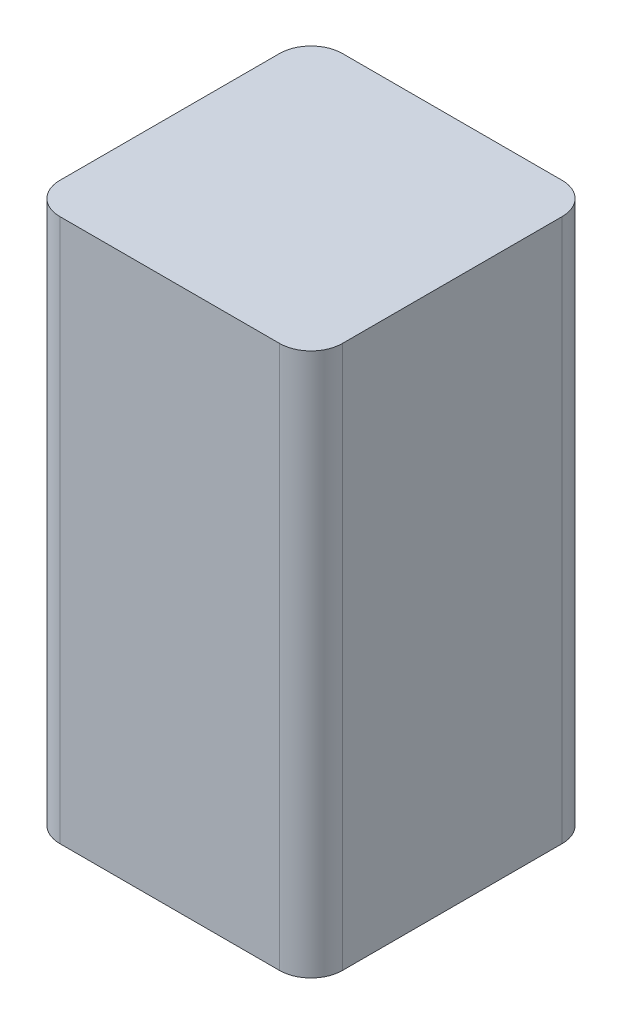
ISO-10303-21;
HEADER;
FILE_DESCRIPTION(('STEP AP214'),'2;1');
FILE_NAME('part.step','',(''),(''),'','','');
FILE_SCHEMA(('AUTOMOTIVE_DESIGN { 1 0 10303 214 1 1 1 1 }'));
ENDSEC;
DATA;
#1=APPLICATION_CONTEXT('core data for automotive mechanical design processes');
#2=APPLICATION_PROTOCOL_DEFINITION('international standard','automotive_design',2000,#1);
#3=PRODUCT_CONTEXT('',#1,'mechanical');
#4=PRODUCT('Part','Part','',(#3));
#5=PRODUCT_RELATED_PRODUCT_CATEGORY('part','',(#4));
#6=PRODUCT_DEFINITION_FORMATION('','',#4);
#7=PRODUCT_DEFINITION_CONTEXT('part definition',#1,'design');
#8=PRODUCT_DEFINITION('design','',#6,#7);
#9=PRODUCT_DEFINITION_SHAPE('','',#8);
#10=(LENGTH_UNIT() NAMED_UNIT(*) SI_UNIT(.MILLI.,.METRE.));
#11=(NAMED_UNIT(*) PLANE_ANGLE_UNIT() SI_UNIT($,.RADIAN.));
#12=(NAMED_UNIT(*) SI_UNIT($,.STERADIAN.) SOLID_ANGLE_UNIT());
#13=UNCERTAINTY_MEASURE_WITH_UNIT(LENGTH_MEASURE(1.E-05),#10,'distance_accuracy_value','');
#14=(GEOMETRIC_REPRESENTATION_CONTEXT(3) GLOBAL_UNCERTAINTY_ASSIGNED_CONTEXT((#13)) GLOBAL_UNIT_ASSIGNED_CONTEXT((#10,
#11,#12)) REPRESENTATION_CONTEXT('',''));
#15=CARTESIAN_POINT('',(0.,0.,0.));
#16=DIRECTION('',(0.,0.,1.));
#17=DIRECTION('',(1.,0.,0.));
#18=AXIS2_PLACEMENT_3D('',#15,#16,#17);
#19=CARTESIAN_POINT('',(-45.,173.,-45.));
#20=DIRECTION('',(1.,0.,0.));
#21=DIRECTION('',(0.,0.,-1.));
#22=AXIS2_PLACEMENT_3D('',#19,#20,#21);
#23=PLANE('',#22);
#24=DIRECTION('',(0.,0.,1.));
#25=VECTOR('',#24,1.);
#26=CARTESIAN_POINT('',(-45.,173.,-45.));
#27=LINE('',#26,#25);
#28=CARTESIAN_POINT('',(-45.,173.,-35.));
#29=VERTEX_POINT('',#28);
#30=CARTESIAN_POINT('',(-45.,173.,35.));
#31=VERTEX_POINT('',#30);
#32=EDGE_CURVE('E132',#29,#31,#27,.T.);
#33=ORIENTED_EDGE('',*,*,#32,.F.);
#34=DIRECTION('',(0.,-1.,0.));
#35=VECTOR('',#34,1.);
#36=CARTESIAN_POINT('',(-45.,0.,-35.));
#37=LINE('',#36,#35);
#38=CARTESIAN_POINT('',(-45.,0.,-35.));
#39=VERTEX_POINT('',#38);
#40=EDGE_CURVE('E116',#29,#39,#37,.T.);
#41=ORIENTED_EDGE('',*,*,#40,.T.);
#42=DIRECTION('',(0.,0.,1.));
#43=VECTOR('',#42,1.);
#44=CARTESIAN_POINT('',(-45.,0.,-45.));
#45=LINE('',#44,#43);
#46=CARTESIAN_POINT('',(-45.,0.,35.));
#47=VERTEX_POINT('',#46);
#48=EDGE_CURVE('E129',#39,#47,#45,.T.);
#49=ORIENTED_EDGE('',*,*,#48,.T.);
#50=DIRECTION('',(0.,-1.,0.));
#51=VECTOR('',#50,1.);
#52=CARTESIAN_POINT('',(-45.,173.,35.));
#53=LINE('',#52,#51);
#54=EDGE_CURVE('E135',#47,#31,#53,.F.);
#55=ORIENTED_EDGE('',*,*,#54,.T.);
#56=EDGE_LOOP('',(#33,#41,#49,#55));
#57=FACE_BOUND('',#56,.T.);
#58=ADVANCED_FACE('F45',(#57),#23,.F.);
#59=CARTESIAN_POINT('',(-45.,173.,45.));
#60=DIRECTION('',(0.,0.,-1.));
#61=DIRECTION('',(-1.,0.,0.));
#62=AXIS2_PLACEMENT_3D('',#59,#60,#61);
#63=PLANE('',#62);
#64=DIRECTION('',(1.,0.,0.));
#65=VECTOR('',#64,1.);
#66=CARTESIAN_POINT('',(-45.,0.,45.));
#67=LINE('',#66,#65);
#68=CARTESIAN_POINT('',(-35.,0.,45.));
#69=VERTEX_POINT('',#68);
#70=CARTESIAN_POINT('',(35.,0.,45.));
#71=VERTEX_POINT('',#70);
#72=EDGE_CURVE('E140',#69,#71,#67,.T.);
#73=ORIENTED_EDGE('',*,*,#72,.T.);
#74=DIRECTION('',(0.,-1.,0.));
#75=VECTOR('',#74,1.);
#76=CARTESIAN_POINT('',(35.,173.,45.));
#77=LINE('',#76,#75);
#78=CARTESIAN_POINT('',(35.,173.,45.));
#79=VERTEX_POINT('',#78);
#80=EDGE_CURVE('E11',#71,#79,#77,.F.);
#81=ORIENTED_EDGE('',*,*,#80,.T.);
#82=DIRECTION('',(1.,0.,0.));
#83=VECTOR('',#82,1.);
#84=CARTESIAN_POINT('',(-45.,173.,45.));
#85=LINE('',#84,#83);
#86=CARTESIAN_POINT('',(-35.,173.,45.));
#87=VERTEX_POINT('',#86);
#88=EDGE_CURVE('E193',#87,#79,#85,.T.);
#89=ORIENTED_EDGE('',*,*,#88,.F.);
#90=DIRECTION('',(0.,-1.,0.));
#91=VECTOR('',#90,1.);
#92=CARTESIAN_POINT('',(-35.,173.,45.));
#93=LINE('',#92,#91);
#94=EDGE_CURVE('E54',#87,#69,#93,.T.);
#95=ORIENTED_EDGE('',*,*,#94,.T.);
#96=EDGE_LOOP('',(#73,#81,#89,#95));
#97=FACE_BOUND('',#96,.T.);
#98=ADVANCED_FACE('F191',(#97),#63,.F.);
#99=CARTESIAN_POINT('',(45.,173.,-45.));
#100=DIRECTION('',(1.,0.,0.));
#101=DIRECTION('',(0.,0.,-1.));
#102=AXIS2_PLACEMENT_3D('',#99,#100,#101);
#103=PLANE('',#102);
#104=DIRECTION('',(0.,0.,1.));
#105=VECTOR('',#104,1.);
#106=CARTESIAN_POINT('',(45.,0.,-45.));
#107=LINE('',#106,#105);
#108=CARTESIAN_POINT('',(45.,0.,-35.));
#109=VERTEX_POINT('',#108);
#110=CARTESIAN_POINT('',(45.,0.,35.));
#111=VERTEX_POINT('',#110);
#112=EDGE_CURVE('E144',#109,#111,#107,.T.);
#113=ORIENTED_EDGE('',*,*,#112,.F.);
#114=DIRECTION('',(0.,-1.,0.));
#115=VECTOR('',#114,1.);
#116=CARTESIAN_POINT('',(45.,173.,-35.));
#117=LINE('',#116,#115);
#118=CARTESIAN_POINT('',(45.,173.,-35.));
#119=VERTEX_POINT('',#118);
#120=EDGE_CURVE('E68',#109,#119,#117,.F.);
#121=ORIENTED_EDGE('',*,*,#120,.T.);
#122=DIRECTION('',(0.,0.,1.));
#123=VECTOR('',#122,1.);
#124=CARTESIAN_POINT('',(45.,173.,-45.));
#125=LINE('',#124,#123);
#126=CARTESIAN_POINT('',(45.,173.,35.));
#127=VERTEX_POINT('',#126);
#128=EDGE_CURVE('E200',#119,#127,#125,.T.);
#129=ORIENTED_EDGE('',*,*,#128,.T.);
#130=DIRECTION('',(0.,-1.,0.));
#131=VECTOR('',#130,1.);
#132=CARTESIAN_POINT('',(45.,0.,35.));
#133=LINE('',#132,#131);
#134=EDGE_CURVE('E181',#127,#111,#133,.T.);
#135=ORIENTED_EDGE('',*,*,#134,.T.);
#136=EDGE_LOOP('',(#113,#121,#129,#135));
#137=FACE_BOUND('',#136,.T.);
#138=ADVANCED_FACE('F199',(#137),#103,.T.);
#139=CARTESIAN_POINT('',(-45.,173.,-45.));
#140=DIRECTION('',(0.,0.,-1.));
#141=DIRECTION('',(-1.,0.,0.));
#142=AXIS2_PLACEMENT_3D('',#139,#140,#141);
#143=PLANE('',#142);
#144=DIRECTION('',(1.,0.,0.));
#145=VECTOR('',#144,1.);
#146=CARTESIAN_POINT('',(-45.,0.,-45.));
#147=LINE('',#146,#145);
#148=CARTESIAN_POINT('',(-35.,0.,-45.));
#149=VERTEX_POINT('',#148);
#150=CARTESIAN_POINT('',(35.,0.,-45.));
#151=VERTEX_POINT('',#150);
#152=EDGE_CURVE('E153',#149,#151,#147,.T.);
#153=ORIENTED_EDGE('',*,*,#152,.F.);
#154=DIRECTION('',(0.,-1.,0.));
#155=VECTOR('',#154,1.);
#156=CARTESIAN_POINT('',(-35.,173.,-45.));
#157=LINE('',#156,#155);
#158=CARTESIAN_POINT('',(-35.,173.,-45.));
#159=VERTEX_POINT('',#158);
#160=EDGE_CURVE('E117',#149,#159,#157,.F.);
#161=ORIENTED_EDGE('',*,*,#160,.T.);
#162=DIRECTION('',(1.,0.,0.));
#163=VECTOR('',#162,1.);
#164=CARTESIAN_POINT('',(-45.,173.,-45.));
#165=LINE('',#164,#163);
#166=CARTESIAN_POINT('',(35.,173.,-45.));
#167=VERTEX_POINT('',#166);
#168=EDGE_CURVE('E147',#159,#167,#165,.T.);
#169=ORIENTED_EDGE('',*,*,#168,.T.);
#170=DIRECTION('',(0.,-1.,0.));
#171=VECTOR('',#170,1.);
#172=CARTESIAN_POINT('',(35.,173.,-45.));
#173=LINE('',#172,#171);
#174=EDGE_CURVE('E123',#167,#151,#173,.T.);
#175=ORIENTED_EDGE('',*,*,#174,.T.);
#176=EDGE_LOOP('',(#153,#161,#169,#175));
#177=FACE_BOUND('',#176,.T.);
#178=ADVANCED_FACE('F232',(#177),#143,.T.);
#179=CARTESIAN_POINT('',(0.,173.,0.));
#180=DIRECTION('',(0.,1.,0.));
#181=DIRECTION('',(0.,0.,1.));
#182=AXIS2_PLACEMENT_3D('',#179,#180,#181);
#183=PLANE('',#182);
#184=ORIENTED_EDGE('',*,*,#168,.F.);
#185=CARTESIAN_POINT('',(-35.,173.,-35.));
#186=DIRECTION('',(0.,1.,0.));
#187=DIRECTION('',(0.,0.,1.));
#188=AXIS2_PLACEMENT_3D('',#185,#186,#187);
#189=CIRCLE('',#188,10.);
#190=EDGE_CURVE('E178',#159,#29,#189,.T.);
#191=ORIENTED_EDGE('',*,*,#190,.T.);
#192=ORIENTED_EDGE('',*,*,#32,.T.);
#193=CARTESIAN_POINT('',(-35.,173.,35.));
#194=DIRECTION('',(0.,1.,0.));
#195=DIRECTION('',(0.,0.,1.));
#196=AXIS2_PLACEMENT_3D('',#193,#194,#195);
#197=CIRCLE('',#196,10.);
#198=EDGE_CURVE('E170',#31,#87,#197,.T.);
#199=ORIENTED_EDGE('',*,*,#198,.T.);
#200=ORIENTED_EDGE('',*,*,#88,.T.);
#201=CARTESIAN_POINT('',(35.,173.,35.));
#202=DIRECTION('',(0.,1.,0.));
#203=DIRECTION('',(0.,0.,1.));
#204=AXIS2_PLACEMENT_3D('',#201,#202,#203);
#205=CIRCLE('',#204,10.);
#206=EDGE_CURVE('E61',#79,#127,#205,.T.);
#207=ORIENTED_EDGE('',*,*,#206,.T.);
#208=ORIENTED_EDGE('',*,*,#128,.F.);
#209=CARTESIAN_POINT('',(35.,173.,-35.));
#210=DIRECTION('',(0.,1.,0.));
#211=DIRECTION('',(0.,0.,1.));
#212=AXIS2_PLACEMENT_3D('',#209,#210,#211);
#213=CIRCLE('',#212,10.);
#214=EDGE_CURVE('E175',#119,#167,#213,.T.);
#215=ORIENTED_EDGE('',*,*,#214,.T.);
#216=EDGE_LOOP('',(#184,#191,#192,#199,#200,#207,#208,#215));
#217=FACE_BOUND('',#216,.T.);
#218=ADVANCED_FACE('F210',(#217),#183,.T.);
#219=CARTESIAN_POINT('',(0.,0.,0.));
#220=DIRECTION('',(0.,1.,0.));
#221=DIRECTION('',(0.,0.,1.));
#222=AXIS2_PLACEMENT_3D('',#219,#220,#221);
#223=PLANE('',#222);
#224=ORIENTED_EDGE('',*,*,#48,.F.);
#225=CARTESIAN_POINT('',(-35.,0.,-35.));
#226=DIRECTION('',(0.,1.,0.));
#227=DIRECTION('',(0.,0.,1.));
#228=AXIS2_PLACEMENT_3D('',#225,#226,#227);
#229=CIRCLE('',#228,10.);
#230=EDGE_CURVE('E112',#39,#149,#229,.F.);
#231=ORIENTED_EDGE('',*,*,#230,.T.);
#232=ORIENTED_EDGE('',*,*,#152,.T.);
#233=CARTESIAN_POINT('',(35.,0.,-35.));
#234=DIRECTION('',(0.,1.,0.));
#235=DIRECTION('',(0.,0.,1.));
#236=AXIS2_PLACEMENT_3D('',#233,#234,#235);
#237=CIRCLE('',#236,10.);
#238=EDGE_CURVE('E124',#151,#109,#237,.F.);
#239=ORIENTED_EDGE('',*,*,#238,.T.);
#240=ORIENTED_EDGE('',*,*,#112,.T.);
#241=CARTESIAN_POINT('',(35.,0.,35.));
#242=DIRECTION('',(0.,1.,0.));
#243=DIRECTION('',(0.,0.,1.));
#244=AXIS2_PLACEMENT_3D('',#241,#242,#243);
#245=CIRCLE('',#244,10.);
#246=EDGE_CURVE('E160',#111,#71,#245,.F.);
#247=ORIENTED_EDGE('',*,*,#246,.T.);
#248=ORIENTED_EDGE('',*,*,#72,.F.);
#249=CARTESIAN_POINT('',(-35.,0.,35.));
#250=DIRECTION('',(0.,1.,0.));
#251=DIRECTION('',(0.,0.,1.));
#252=AXIS2_PLACEMENT_3D('',#249,#250,#251);
#253=CIRCLE('',#252,10.);
#254=EDGE_CURVE('E134',#69,#47,#253,.F.);
#255=ORIENTED_EDGE('',*,*,#254,.T.);
#256=EDGE_LOOP('',(#224,#231,#232,#239,#240,#247,#248,#255));
#257=FACE_BOUND('',#256,.T.);
#258=ADVANCED_FACE('F137',(#257),#223,.F.);
#259=CARTESIAN_POINT('',(-35.,173.,-35.));
#260=DIRECTION('',(0.,1.,0.));
#261=DIRECTION('',(0.,0.,1.));
#262=AXIS2_PLACEMENT_3D('',#259,#260,#261);
#263=CYLINDRICAL_SURFACE('',#262,10.);
#264=ORIENTED_EDGE('',*,*,#190,.F.);
#265=ORIENTED_EDGE('',*,*,#160,.F.);
#266=ORIENTED_EDGE('',*,*,#230,.F.);
#267=ORIENTED_EDGE('',*,*,#40,.F.);
#268=EDGE_LOOP('',(#264,#265,#266,#267));
#269=FACE_BOUND('',#268,.T.);
#270=ADVANCED_FACE('F115',(#269),#263,.T.);
#271=CARTESIAN_POINT('',(35.,173.,-35.));
#272=DIRECTION('',(0.,-1.,0.));
#273=DIRECTION('',(0.,0.,-1.));
#274=AXIS2_PLACEMENT_3D('',#271,#272,#273);
#275=CYLINDRICAL_SURFACE('',#274,10.);
#276=ORIENTED_EDGE('',*,*,#214,.F.);
#277=ORIENTED_EDGE('',*,*,#120,.F.);
#278=ORIENTED_EDGE('',*,*,#238,.F.);
#279=ORIENTED_EDGE('',*,*,#174,.F.);
#280=EDGE_LOOP('',(#276,#277,#278,#279));
#281=FACE_BOUND('',#280,.T.);
#282=ADVANCED_FACE('F215',(#281),#275,.T.);
#283=CARTESIAN_POINT('',(35.,173.,35.));
#284=DIRECTION('',(0.,1.,0.));
#285=DIRECTION('',(0.,0.,1.));
#286=AXIS2_PLACEMENT_3D('',#283,#284,#285);
#287=CYLINDRICAL_SURFACE('',#286,10.);
#288=ORIENTED_EDGE('',*,*,#206,.F.);
#289=ORIENTED_EDGE('',*,*,#80,.F.);
#290=ORIENTED_EDGE('',*,*,#246,.F.);
#291=ORIENTED_EDGE('',*,*,#134,.F.);
#292=EDGE_LOOP('',(#288,#289,#290,#291));
#293=FACE_BOUND('',#292,.T.);
#294=ADVANCED_FACE('F198',(#293),#287,.T.);
#295=CARTESIAN_POINT('',(-35.,173.,35.));
#296=DIRECTION('',(0.,-1.,0.));
#297=DIRECTION('',(0.,0.,-1.));
#298=AXIS2_PLACEMENT_3D('',#295,#296,#297);
#299=CYLINDRICAL_SURFACE('',#298,10.);
#300=ORIENTED_EDGE('',*,*,#198,.F.);
#301=ORIENTED_EDGE('',*,*,#54,.F.);
#302=ORIENTED_EDGE('',*,*,#254,.F.);
#303=ORIENTED_EDGE('',*,*,#94,.F.);
#304=EDGE_LOOP('',(#300,#301,#302,#303));
#305=FACE_BOUND('',#304,.T.);
#306=ADVANCED_FACE('F47',(#305),#299,.T.);
#307=CLOSED_SHELL('',(#58,#98,#138,#178,#218,#258,#270,#282,#294,#306));
#308=MANIFOLD_SOLID_BREP('B2',#307);
#309=ADVANCED_BREP_SHAPE_REPRESENTATION('',(#18,#308),#14);
#310=SHAPE_DEFINITION_REPRESENTATION(#9,#309);
ENDSEC;
END-ISO-10303-21;
